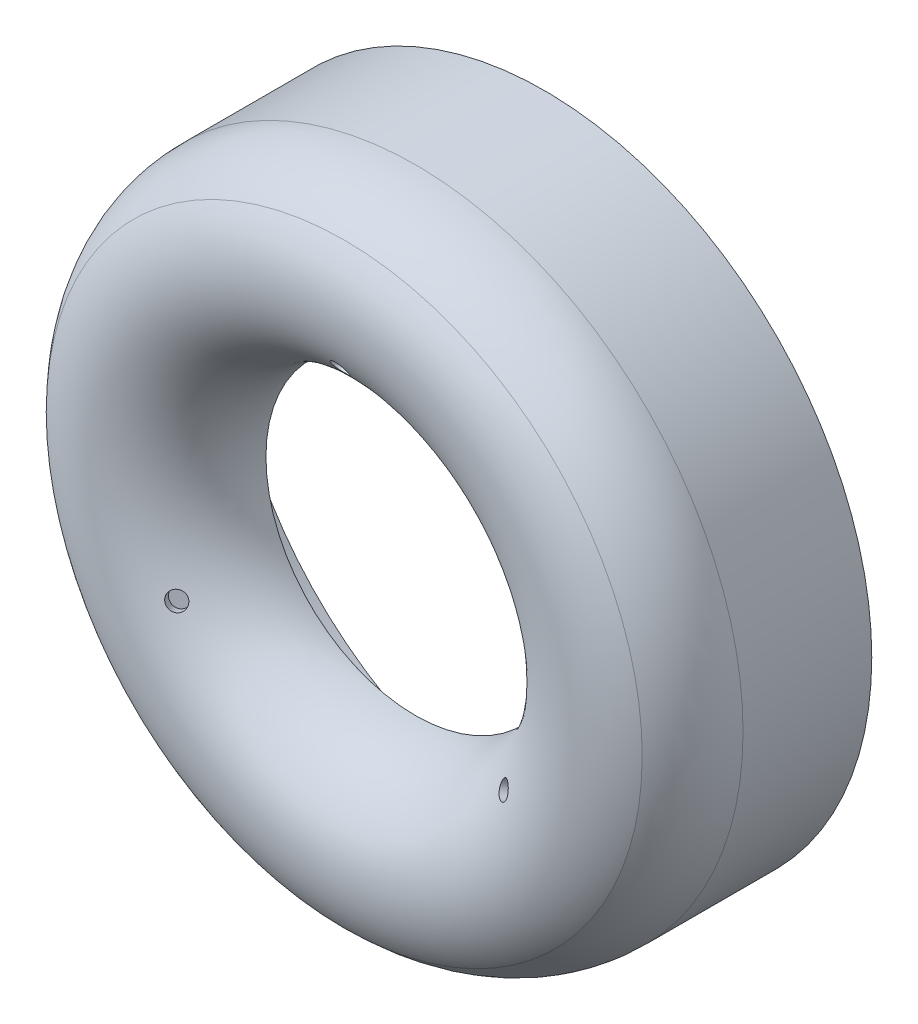
ISO-10303-21;
HEADER;
FILE_DESCRIPTION(('STEP AP214'),'2;1');
FILE_NAME('part.step','',(''),(''),'','','');
FILE_SCHEMA(('AUTOMOTIVE_DESIGN { 1 0 10303 214 1 1 1 1 }'));
ENDSEC;
DATA;
#1=APPLICATION_CONTEXT('core data for automotive mechanical design processes');
#2=APPLICATION_PROTOCOL_DEFINITION('international standard','automotive_design',2000,#1);
#3=PRODUCT_CONTEXT('',#1,'mechanical');
#4=PRODUCT('Part','Part','',(#3));
#5=PRODUCT_RELATED_PRODUCT_CATEGORY('part','',(#4));
#6=PRODUCT_DEFINITION_FORMATION('','',#4);
#7=PRODUCT_DEFINITION_CONTEXT('part definition',#1,'design');
#8=PRODUCT_DEFINITION('design','',#6,#7);
#9=PRODUCT_DEFINITION_SHAPE('','',#8);
#10=(LENGTH_UNIT() NAMED_UNIT(*) SI_UNIT(.MILLI.,.METRE.));
#11=(NAMED_UNIT(*) PLANE_ANGLE_UNIT() SI_UNIT($,.RADIAN.));
#12=(NAMED_UNIT(*) SI_UNIT($,.STERADIAN.) SOLID_ANGLE_UNIT());
#13=UNCERTAINTY_MEASURE_WITH_UNIT(LENGTH_MEASURE(1.E-05),#10,'distance_accuracy_value','');
#14=(GEOMETRIC_REPRESENTATION_CONTEXT(3) GLOBAL_UNCERTAINTY_ASSIGNED_CONTEXT((#13)) GLOBAL_UNIT_ASSIGNED_CONTEXT((#10,
#11,#12)) REPRESENTATION_CONTEXT('',''));
#15=CARTESIAN_POINT('',(0.,0.,0.));
#16=DIRECTION('',(0.,0.,1.));
#17=DIRECTION('',(1.,0.,0.));
#18=AXIS2_PLACEMENT_3D('',#15,#16,#17);
#19=CARTESIAN_POINT('',(0.,0.,22.05));
#20=DIRECTION('',(0.,0.,1.));
#21=DIRECTION('',(1.,0.,0.));
#22=AXIS2_PLACEMENT_3D('',#19,#20,#21);
#23=TOROIDAL_SURFACE('',#22,40.714829630286,13.914829630286);
#24=CARTESIAN_POINT('',(0.,0.,32.6899915095282));
#25=DIRECTION('',(0.,0.,1.));
#26=DIRECTION('',(1.,0.,0.));
#27=AXIS2_PLACEMENT_3D('',#24,#25,#26);
#28=CIRCLE('',#27,49.6821628078284);
#29=CARTESIAN_POINT('',(49.6821628078284,0.,32.6899915095282));
#30=VERTEX_POINT('',#29);
#31=EDGE_CURVE('E10',#30,#30,#28,.T.);
#32=ORIENTED_EDGE('',*,*,#31,.F.);
#33=EDGE_LOOP('',(#32));
#34=FACE_BOUND('',#33,.T.);
#35=CARTESIAN_POINT('',(0.,0.,22.05));
#36=DIRECTION('',(0.,0.,1.));
#37=DIRECTION('',(1.,0.,0.));
#38=AXIS2_PLACEMENT_3D('',#35,#36,#37);
#39=CIRCLE('',#38,26.8);
#40=CARTESIAN_POINT('',(26.8,0.,22.05));
#41=VERTEX_POINT('',#40);
#42=EDGE_CURVE('E55',#41,#41,#39,.T.);
#43=ORIENTED_EDGE('',*,*,#42,.T.);
#44=EDGE_LOOP('',(#43));
#45=FACE_BOUND('',#44,.T.);
#46=CARTESIAN_POINT('',(-0.521733762011657,31.8325098529892,32.7646073244406));
#47=CARTESIAN_POINT('',(-0.600944180860553,31.8550456416767,32.7843540172794));
#48=CARTESIAN_POINT('',(-0.677641653263316,31.8827829213394,32.8084899768785));
#49=CARTESIAN_POINT('',(-0.823807933247065,31.948029349292,32.8644484058016));
#50=CARTESIAN_POINT('',(-0.893267630618797,31.9855506096301,32.8962803988242));
#51=CARTESIAN_POINT('',(-1.02293757314441,32.0694724945865,32.96623048243));
#52=CARTESIAN_POINT('',(-1.0831573358239,32.1158638704251,33.0043420197232));
#53=CARTESIAN_POINT('',(-1.19279690070853,32.2165078415608,33.0853668560714));
#54=CARTESIAN_POINT('',(-1.24221910139305,32.2707586865597,33.1282790855322));
#55=CARTESIAN_POINT('',(-1.32930910287886,32.386393526415,33.2177328219196));
#56=CARTESIAN_POINT('',(-1.36687145306284,32.4478352017401,33.2643025289609));
#57=CARTESIAN_POINT('',(-1.42855542283515,32.5759556899049,33.3591190607013));
#58=CARTESIAN_POINT('',(-1.45267694174304,32.6426345419702,33.4073658979602));
#59=CARTESIAN_POINT('',(-1.48663799850221,32.7791312708159,33.5037247567194));
#60=CARTESIAN_POINT('',(-1.49654576570788,32.8489324816822,33.5518363083023));
#61=CARTESIAN_POINT('',(-1.50193835595653,32.9899988637126,33.6467011717599));
#62=CARTESIAN_POINT('',(-1.49742417788842,33.0612639331477,33.6934545774759));
#63=CARTESIAN_POINT('',(-1.47418494527232,33.2023153825031,33.7837902595701));
#64=CARTESIAN_POINT('',(-1.45562282578949,33.2721093543175,33.8274026613757));
#65=CARTESIAN_POINT('',(-1.40498283882947,33.4089201739399,33.9109815256538));
#66=CARTESIAN_POINT('',(-1.37290525135532,33.4759370792493,33.9509480636376));
#67=CARTESIAN_POINT('',(-1.29627959110834,33.6048690455523,34.0262564831292));
#68=CARTESIAN_POINT('',(-1.25177603840935,33.6668013172499,34.0616142256976));
#69=CARTESIAN_POINT('',(-1.15150804595216,33.7838756791506,34.1272378110669));
#70=CARTESIAN_POINT('',(-1.09574331829425,33.8390175956956,34.1575035236501));
#71=CARTESIAN_POINT('',(-0.974261085444931,33.9409631295014,34.2125998310252));
#72=CARTESIAN_POINT('',(-0.908502434210482,33.987730448627,34.2374068675623));
#73=CARTESIAN_POINT('',(-0.769057259859289,34.0711099677341,34.2811005577733));
#74=CARTESIAN_POINT('',(-0.695370617941962,34.1077220155099,34.2999871227128));
#75=CARTESIAN_POINT('',(-0.541906865659562,34.1696686624802,34.3316761813297));
#76=CARTESIAN_POINT('',(-0.462111975159515,34.1949687497289,34.3444600641022));
#77=CARTESIAN_POINT('',(-0.298892487636837,34.233268906957,34.3637293105502));
#78=CARTESIAN_POINT('',(-0.215467927468518,34.2462691017946,34.3702147381624));
#79=CARTESIAN_POINT('',(-0.047468869767225,34.2595152616345,34.376822297076));
#80=CARTESIAN_POINT('',(0.0371040582698576,34.259777165248,34.3769523804153));
#81=CARTESIAN_POINT('',(0.205095770772846,34.2475779715461,34.3708681208134));
#82=CARTESIAN_POINT('',(0.288514558459395,34.2351169097415,34.3646537955801));
#83=CARTESIAN_POINT('',(0.451757627075509,34.1979152880807,34.3459470869414));
#84=CARTESIAN_POINT('',(0.531584964410561,34.1731853934479,34.3334601561567));
#85=CARTESIAN_POINT('',(0.685469660887598,34.1122873181978,34.3023355895262));
#86=CARTESIAN_POINT('',(0.759526924342255,34.0761189479423,34.2836978517061));
#87=CARTESIAN_POINT('',(0.899904983934606,33.9934774596357,34.2404426458986));
#88=CARTESIAN_POINT('',(0.966212416763898,33.946986931496,34.2158150682413));
#89=CARTESIAN_POINT('',(1.08906912759826,33.8452647694829,34.1609153656609));
#90=CARTESIAN_POINT('',(1.14561840548235,33.7900331355011,34.1306432406678));
#91=CARTESIAN_POINT('',(1.24733824795143,33.6726324906937,34.0649242205711));
#92=CARTESIAN_POINT('',(1.29251140905153,33.610465067594,34.0294785092232));
#93=CARTESIAN_POINT('',(1.3702009930816,33.481173100958,33.9540492384137));
#94=CARTESIAN_POINT('',(1.40271789267493,33.4140487442243,33.9140658499244));
#95=CARTESIAN_POINT('',(1.45405367960733,33.2772653383214,33.830597582033));
#96=CARTESIAN_POINT('',(1.47293381334469,33.2076191163354,33.7871293450118));
#97=CARTESIAN_POINT('',(1.49672515719545,33.0676256973451,33.6975822601417));
#98=CARTESIAN_POINT('',(1.50163669121296,32.9972785166325,33.6515034728515));
#99=CARTESIAN_POINT('',(1.49741006839095,32.8580727664132,33.558065695187));
#100=CARTESIAN_POINT('',(1.48829937045267,32.7892115546296,33.5107093848198));
#101=CARTESIAN_POINT('',(1.45640411226914,32.6547233011676,33.416011629454));
#102=CARTESIAN_POINT('',(1.43361888391676,32.5890964176807,33.3686701852948));
#103=CARTESIAN_POINT('',(1.37483945028157,32.4622688676565,33.275124596236));
#104=CARTESIAN_POINT('',(1.33874442041995,32.4011063713146,33.2289320831787));
#105=CARTESIAN_POINT('',(1.25440228426602,32.2852482251926,33.1396291633256));
#106=CARTESIAN_POINT('',(1.20615415338853,32.230553121227,33.0965190167869));
#107=CARTESIAN_POINT('',(1.09822817163446,32.1283183658427,33.0144891263922));
#108=CARTESIAN_POINT('',(1.03843057459374,32.0808639274587,32.9756206225637));
#109=CARTESIAN_POINT('',(0.90938652706051,31.9949136412282,32.9041670780569));
#110=CARTESIAN_POINT('',(0.840140351186139,31.9564175331003,32.8715818548246));
#111=CARTESIAN_POINT('',(0.694238168389602,31.8893174001074,32.8141429460326));
#112=CARTESIAN_POINT('',(0.617596637797148,31.8606945317368,32.7892745418052));
#113=CARTESIAN_POINT('',(0.458939735121118,31.8139045988393,32.7483285257738));
#114=CARTESIAN_POINT('',(0.376923881486116,31.7957384726908,32.7322517029246));
#115=CARTESIAN_POINT('',(0.21135514315845,31.7705215411624,32.7098696806777));
#116=CARTESIAN_POINT('',(0.127851619547708,31.7632881710575,32.7034040167038));
#117=CARTESIAN_POINT('',(-0.0395234340419496,31.7595393091723,32.7000583667873));
#118=CARTESIAN_POINT('',(-0.123394434647576,31.76301158303,32.7031674388747));
#119=CARTESIAN_POINT('',(-0.260087647539851,31.7774766097883,32.7160421684466));
#120=CARTESIAN_POINT('',(-0.313522157988213,31.7854188410154,32.7231033727462));
#121=CARTESIAN_POINT('',(-0.418894912846663,31.8056947490119,32.7410413690391));
#122=CARTESIAN_POINT('',(-0.470833178257869,31.8180283641117,32.7519181074498));
#123=CARTESIAN_POINT('',(-0.521733762011657,31.8325098529892,32.7646073244406));
#124=B_SPLINE_CURVE_WITH_KNOTS('',3,(#46,#47,#48,#49,#50,#51,#52,#53,#54,#55,#56,#57,#58,#59,
#60,#61,#62,#63,#64,#65,#66,#67,#68,#69,#70,#71,#72,#73,#74,#75,#76,#77,#78,#79,#80,#81,#82,#83,
#84,#85,#86,#87,#88,#89,#90,#91,#92,#93,#94,#95,#96,#97,#98,#99,#100,#101,#102,#103,#104,#105,
#106,#107,#108,#109,#110,#111,#112,#113,#114,#115,#116,#117,#118,#119,#120,#121,#122,#123),
.UNSPECIFIED.,.T.,.F.,(4,2,2,2,2,2,2,2,2,2,2,2,2,2,2,2,2,2,2,2,2,2,2,2,2,2,2,2,2,2,2,2,2,2,2,2,
2,2,4),(0.,0.253862466223943,0.508040705128627,0.761955346168333,1.0158135272751,
1.27186913514604,1.52792666101161,1.7827508898161,2.03755746943589,2.28945312308016,
2.541343558401,2.79234284568289,3.04334855074714,3.29541716391616,3.54748955484821,
3.80032583791044,4.05315955436621,4.30567690797157,4.55819355678178,4.81049107799202,
5.06279278225784,5.31552331377957,5.56825384843436,5.82092664681334,6.07358992804378,
6.32511125199196,6.57662674361184,6.82765033372364,7.07868618928813,7.33166412718057,
7.58466339989531,7.84044218198319,8.09621353157364,8.35149399394215,8.60679736137429,
8.85778843015269,9.10849277382117,9.27162698483638,9.4347589050024),.UNSPECIFIED.);
#125=CARTESIAN_POINT('',(-0.521733762011657,31.8325098529892,32.7646073244406));
#126=VERTEX_POINT('',#125);
#127=EDGE_CURVE('E72',#126,#126,#124,.T.);
#128=ORIENTED_EDGE('',*,*,#127,.F.);
#129=EDGE_LOOP('',(#128));
#130=FACE_BOUND('',#129,.T.);
#131=CARTESIAN_POINT('',(27.2572563700765,-16.7006977895752,32.8709565622991));
#132=CARTESIAN_POINT('',(27.2607517234313,-16.6230209975031,32.8405588810337));
#133=CARTESIAN_POINT('',(27.2701693774533,-16.5442089031033,32.8136176949745));
#134=CARTESIAN_POINT('',(27.3004895993714,-16.3863841748502,32.7678388012722));
#135=CARTESIAN_POINT('',(27.3214013513845,-16.3073714309906,32.7490075952261));
#136=CARTESIAN_POINT('',(27.3740536058676,-16.1513050459985,32.7203354396635));
#137=CARTESIAN_POINT('',(27.4057976572242,-16.0742520558232,32.7104974403995));
#138=CARTESIAN_POINT('',(27.4791470294836,-15.9243450347842,32.7003050422349));
#139=CARTESIAN_POINT('',(27.5207501148873,-15.8514900566859,32.6999484955222));
#140=CARTESIAN_POINT('',(27.612126231127,-15.7128093909474,32.7086835883996));
#141=CARTESIAN_POINT('',(27.6618096294104,-15.6469183778188,32.717676832681));
#142=CARTESIAN_POINT('',(27.7682895961571,-15.5231841872399,32.7445317226589));
#143=CARTESIAN_POINT('',(27.8250865555842,-15.4653414524948,32.7623938559526));
#144=CARTESIAN_POINT('',(27.944576590536,-15.3591096260089,32.8062670601876));
#145=CARTESIAN_POINT('',(28.0072939128569,-15.3107621508103,32.8323127580164));
#146=CARTESIAN_POINT('',(28.1368746647434,-15.2251826949666,32.8914086121246));
#147=CARTESIAN_POINT('',(28.2037385171549,-15.1879518502074,32.924459483596));
#148=CARTESIAN_POINT('',(28.3412848384627,-15.1250920259081,32.9969062740922));
#149=CARTESIAN_POINT('',(28.4120148251461,-15.0996881045268,33.0364073483018));
#150=CARTESIAN_POINT('',(28.5544353224741,-15.0622971765826,33.1197912185799));
#151=CARTESIAN_POINT('',(28.62612589552,-15.0503110459831,33.1636743005185));
#152=CARTESIAN_POINT('',(28.7694446394155,-15.0401625129257,33.2547186244924));
#153=CARTESIAN_POINT('',(28.8410645876462,-15.0421435306605,33.301908936218));
#154=CARTESIAN_POINT('',(28.9816097480388,-15.0603569816579,33.3975385762202));
#155=CARTESIAN_POINT('',(29.0505350693808,-15.0765888368823,33.4459778537593));
#156=CARTESIAN_POINT('',(29.1833296319553,-15.1228015293922,33.542226003454));
#157=CARTESIAN_POINT('',(29.2472295407036,-15.1526899054955,33.5900369253654));
#158=CARTESIAN_POINT('',(29.3686135931263,-15.2253916164503,33.6839438963462));
#159=CARTESIAN_POINT('',(29.4260981558567,-15.2682041064095,33.730040057294));
#160=CARTESIAN_POINT('',(29.5323005157153,-15.3649741556122,33.8187893988588));
#161=CARTESIAN_POINT('',(29.5811076803323,-15.4188041180736,33.8614748385835));
#162=CARTESIAN_POINT('',(29.6691928725449,-15.5362994093244,33.9429627725555));
#163=CARTESIAN_POINT('',(29.7084709996117,-15.5999646354345,33.981765307333));
#164=CARTESIAN_POINT('',(29.7761400837693,-15.7350802261122,34.0546222653931));
#165=CARTESIAN_POINT('',(29.8045542277992,-15.8065135875967,34.0886867011178));
#166=CARTESIAN_POINT('',(29.8496336470919,-15.9551578156078,34.151582322066));
#167=CARTESIAN_POINT('',(29.8662986150245,-16.0323688332057,34.1804133703818));
#168=CARTESIAN_POINT('',(29.8872729006629,-16.1906588251555,34.2325427902727));
#169=CARTESIAN_POINT('',(29.8915251623864,-16.2717539248322,34.2558151629458));
#170=CARTESIAN_POINT('',(29.8872114905191,-16.4350942659937,34.2963657604047));
#171=CARTESIAN_POINT('',(29.8786454093449,-16.5173395207099,34.3136439161735));
#172=CARTESIAN_POINT('',(29.8487465074311,-16.6807737888002,34.3420528436148));
#173=CARTESIAN_POINT('',(29.8273830099466,-16.7619597836627,34.3531687199815));
#174=CARTESIAN_POINT('',(29.7723615821151,-16.9207037489907,34.3690792771478));
#175=CARTESIAN_POINT('',(29.738703794994,-16.9982617617096,34.3738740315841));
#176=CARTESIAN_POINT('',(29.6600641610371,-17.1473974589687,34.3770956139001));
#177=CARTESIAN_POINT('',(29.6150997648604,-17.2189841350018,34.3755321990906));
#178=CARTESIAN_POINT('',(29.515116027141,-17.3542840479245,34.3660737852457));
#179=CARTESIAN_POINT('',(29.4600966789561,-17.4179972796131,34.3581787820275));
#180=CARTESIAN_POINT('',(29.341671800774,-17.5357605663327,34.3361374067841));
#181=CARTESIAN_POINT('',(29.278270338245,-17.5898152784872,34.3219940590576));
#182=CARTESIAN_POINT('',(29.144980786888,-17.6868516954966,34.2876014803188));
#183=CARTESIAN_POINT('',(29.0750925928732,-17.7298332207495,34.2673521502817));
#184=CARTESIAN_POINT('',(28.9308377431654,-17.8036756999053,34.2209402047606));
#185=CARTESIAN_POINT('',(28.8564633231234,-17.8345149020296,34.1947671082843));
#186=CARTESIAN_POINT('',(28.7056443095951,-17.8831977584271,34.1368817275161));
#187=CARTESIAN_POINT('',(28.6291997238117,-17.901041461048,34.1051694638324));
#188=CARTESIAN_POINT('',(28.4766739886539,-17.9233238103056,34.0367419924127));
#189=CARTESIAN_POINT('',(28.4005925852206,-17.9277738595098,34.0000310680927));
#190=CARTESIAN_POINT('',(28.2510852272688,-17.9232760754043,33.9222798177203));
#191=CARTESIAN_POINT('',(28.1776591698983,-17.914328761598,33.8812396595981));
#192=CARTESIAN_POINT('',(28.0360504524396,-17.883464879509,33.7959354805361));
#193=CARTESIAN_POINT('',(27.9678446435841,-17.8616098280044,33.7516876189147));
#194=CARTESIAN_POINT('',(27.8383183802123,-17.8056908154226,33.6608979974068));
#195=CARTESIAN_POINT('',(27.7769976097724,-17.771627414833,33.6143563429134));
#196=CARTESIAN_POINT('',(27.6630271648053,-17.6923622801782,33.520305300813));
#197=CARTESIAN_POINT('',(27.610369179213,-17.6471713270607,33.4727968904788));
#198=CARTESIAN_POINT('',(27.5150198105954,-17.5469119387533,33.3781728223168));
#199=CARTESIAN_POINT('',(27.4723309539729,-17.4918410059919,33.3310572669582));
#200=CARTESIAN_POINT('',(27.3976017938036,-17.3727727555119,33.2383057897556));
#201=CARTESIAN_POINT('',(27.3656640548401,-17.3086972954,33.1926876707728));
#202=CARTESIAN_POINT('',(27.3136825957344,-17.173727953897,33.1049981386469));
#203=CARTESIAN_POINT('',(27.2936284977787,-17.1028400847547,33.062923658527));
#204=CARTESIAN_POINT('',(27.2696490262882,-16.9767866091505,32.9950179093192));
#205=CARTESIAN_POINT('',(27.2627703889567,-16.9228233311359,32.9679515905746));
#206=CARTESIAN_POINT('',(27.2553038764026,-16.8130058609683,32.9169671129284));
#207=CARTESIAN_POINT('',(27.2547160201078,-16.7571516631263,32.8930489634993));
#208=CARTESIAN_POINT('',(27.2572563700765,-16.7006977895752,32.8709565622991));
#209=B_SPLINE_CURVE_WITH_KNOTS('',3,(#131,#132,#133,#134,#135,#136,#137,#138,#139,#140,#141,
#142,#143,#144,#145,#146,#147,#148,#149,#150,#151,#152,#153,#154,#155,#156,#157,#158,#159,#160,
#161,#162,#163,#164,#165,#166,#167,#168,#169,#170,#171,#172,#173,#174,#175,#176,#177,#178,#179,
#180,#181,#182,#183,#184,#185,#186,#187,#188,#189,#190,#191,#192,#193,#194,#195,#196,#197,#198,
#199,#200,#201,#202,#203,#204,#205,#206,#207,#208),.UNSPECIFIED.,.T.,.F.,(4,2,2,2,2,2,2,2,2,2,2,
2,2,2,2,2,2,2,2,2,2,2,2,2,2,2,2,2,2,2,2,2,2,2,2,2,2,2,4),(0.,0.250243410467582,
0.500687063948589,0.751212846881025,1.0016818782922,1.24954144901038,1.49741464815922,
1.74635112045198,1.99531302012218,2.24883621827794,2.50237596640846,2.75852292470621,
3.01465949372754,3.26908702046108,3.52349791802324,3.77511406970792,4.02672759471981,
4.27780106413575,4.52888110078855,4.78111344323372,5.03334868976688,5.28619100373726,
5.5390303722414,5.79148187742137,6.04393354936772,6.29626316429923,6.54859687164121,
6.80138057546274,7.0541633388345,7.30673083689121,7.55928854150763,7.81065218938443,
8.06200429858629,8.31311383651166,8.56428694238129,8.81779246516045,9.07107627769194,
9.25294742567177,9.43481912086778),.UNSPECIFIED.);
#210=CARTESIAN_POINT('',(27.2572563700765,-16.7006977895752,32.8709565622991));
#211=VERTEX_POINT('',#210);
#212=EDGE_CURVE('E73',#211,#211,#209,.T.);
#213=ORIENTED_EDGE('',*,*,#212,.F.);
#214=EDGE_LOOP('',(#213));
#215=FACE_BOUND('',#214,.T.);
#216=CARTESIAN_POINT('',(-29.8504120536012,-16.6641223520567,34.3385248705906));
#217=CARTESIAN_POINT('',(-29.868739558452,-16.582814311236,34.3259723774176));
#218=CARTESIAN_POINT('',(-29.8807435013239,-16.500509837896,34.3102946793862));
#219=CARTESIAN_POINT('',(-29.8918711519991,-16.3363548797917,34.2728499220198));
#220=CARTESIAN_POINT('',(-29.8909814859554,-16.2545049545215,34.2510765629359));
#221=CARTESIAN_POINT('',(-29.876505210076,-16.0937595303902,34.2017144116568));
#222=CARTESIAN_POINT('',(-29.8629233080691,-16.0148629473546,34.1741277786707));
#223=CARTESIAN_POINT('',(-29.8236453989792,-15.8623659831327,34.1135302523721));
#224=CARTESIAN_POINT('',(-29.7979520984628,-15.7887644228871,34.0805205720357));
#225=CARTESIAN_POINT('',(-29.7354135221929,-15.6491353260737,34.0096680521228));
#226=CARTESIAN_POINT('',(-29.698582442265,-15.583098294887,33.9718314001196));
#227=CARTESIAN_POINT('',(-29.6149840439605,-15.4604798108746,33.8920347907847));
#228=CARTESIAN_POINT('',(-29.568216807665,-15.4038982799453,33.8500748675162));
#229=CARTESIAN_POINT('',(-29.4664846516541,-15.3021283728216,33.7631979771598));
#230=CARTESIAN_POINT('',(-29.4115603715432,-15.2568863456569,33.7182962535));
#231=CARTESIAN_POINT('',(-29.2950129266318,-15.1787381442654,33.6265010966536));
#232=CARTESIAN_POINT('',(-29.2333898162571,-15.1458318698247,33.5796076796507));
#233=CARTESIAN_POINT('',(-29.1052077348758,-15.0932262105626,33.4851369442667));
#234=CARTESIAN_POINT('',(-29.0386476247876,-15.0735298841783,33.4375594701117));
#235=CARTESIAN_POINT('',(-28.9024146621357,-15.0477988516044,33.3431744754627));
#236=CARTESIAN_POINT('',(-28.8327416173848,-15.0417649901029,33.2963670027522));
#237=CARTESIAN_POINT('',(-28.6913776802367,-15.0434025126177,33.2045898783524));
#238=CARTESIAN_POINT('',(-28.61967367708,-15.0512093676974,33.1596428484155));
#239=CARTESIAN_POINT('',(-28.4766936424144,-15.0804431733159,33.0736604685777));
#240=CARTESIAN_POINT('',(-28.4054176441625,-15.1018711687753,33.0326254190549));
#241=CARTESIAN_POINT('',(-28.2643759260512,-15.1579101837523,32.9556620203584));
#242=CARTESIAN_POINT('',(-28.1946299507311,-15.1926398433882,32.9197837457995));
#243=CARTESIAN_POINT('',(-28.059061128903,-15.2742137201264,32.8550689547715));
#244=CARTESIAN_POINT('',(-27.9932381442098,-15.3210575102042,32.826232190158));
#245=CARTESIAN_POINT('',(-27.8676237295448,-15.425126150105,32.7770500145475));
#246=CARTESIAN_POINT('',(-27.8077953916122,-15.4822805148276,32.7566498686672));
#247=CARTESIAN_POINT('',(-27.6952958291613,-15.6054802989021,32.725036534091));
#248=CARTESIAN_POINT('',(-27.6426236514914,-15.6715245318467,32.7138221209155));
#249=CARTESIAN_POINT('',(-27.5468317053155,-15.809228990542,32.7012520558589));
#250=CARTESIAN_POINT('',(-27.50355280496,-15.8807622506941,32.6997173091808));
#251=CARTESIAN_POINT('',(-27.4265734669656,-16.0284093458256,32.7061039751221));
#252=CARTESIAN_POINT('',(-27.3928725219855,-16.1045229379275,32.7140248867627));
#253=CARTESIAN_POINT('',(-27.3362787134235,-16.2585492199912,32.7388376080816));
#254=CARTESIAN_POINT('',(-27.3133016374383,-16.3364426739169,32.7556572281418));
#255=CARTESIAN_POINT('',(-27.2784631388306,-16.4925242676243,32.7974522742148));
#256=CARTESIAN_POINT('',(-27.2666025027936,-16.5707124278661,32.8224282771946));
#257=CARTESIAN_POINT('',(-27.254350415027,-16.7263688498934,32.8798281453319));
#258=CARTESIAN_POINT('',(-27.2541072181704,-16.8038152006799,32.9123429653488));
#259=CARTESIAN_POINT('',(-27.2656244993893,-16.9550083736168,32.9833101007172));
#260=CARTESIAN_POINT('',(-27.2773862234326,-17.0287548109267,33.0217630320223));
#261=CARTESIAN_POINT('',(-27.3130998534717,-17.1719526166327,33.1038569214768));
#262=CARTESIAN_POINT('',(-27.3372597244206,-17.2413072628488,33.1475763186045));
#263=CARTESIAN_POINT('',(-27.3974271960725,-17.3724907732099,33.2380535070063));
#264=CARTESIAN_POINT('',(-27.4334350116097,-17.4343195008625,33.2848113533632));
#265=CARTESIAN_POINT('',(-27.5165916188866,-17.5489225876307,33.3798780154868));
#266=CARTESIAN_POINT('',(-27.5637671703224,-17.601674665055,33.4281903119034));
#267=CARTESIAN_POINT('',(-27.6680051237536,-17.6964282456004,33.524691710653));
#268=CARTESIAN_POINT('',(-27.7250668559592,-17.7384304765477,33.5728808211074));
#269=CARTESIAN_POINT('',(-27.8468156683247,-17.810028256347,33.6671751186357));
#270=CARTESIAN_POINT('',(-27.9114138957605,-17.8397526947403,33.7132971728335));
#271=CARTESIAN_POINT('',(-28.0468279044234,-17.8865084840573,33.8027620089005));
#272=CARTESIAN_POINT('',(-28.1176434195604,-17.9035403779061,33.8461049095758));
#273=CARTESIAN_POINT('',(-28.2627616283519,-17.9242460690832,33.9286441301121));
#274=CARTESIAN_POINT('',(-28.3370324004283,-17.9280241996026,33.9678704678015));
#275=CARTESIAN_POINT('',(-28.4873123228525,-17.9223101384868,34.0417601201067));
#276=CARTESIAN_POINT('',(-28.5633214956638,-17.9128177752747,34.0764233757192));
#277=CARTESIAN_POINT('',(-28.71489416971,-17.8806967050588,34.1406391453123));
#278=CARTESIAN_POINT('',(-28.7904565618787,-17.8580432895034,34.1701819102714));
#279=CARTESIAN_POINT('',(-28.9386748306507,-17.8001113638213,34.2236376185988));
#280=CARTESIAN_POINT('',(-29.0113307262108,-17.7648329360525,34.2475505986906));
#281=CARTESIAN_POINT('',(-29.1518332521382,-17.682351573785,34.2895386926995));
#282=CARTESIAN_POINT('',(-29.2196571710249,-17.6350965474327,34.3075874971354));
#283=CARTESIAN_POINT('',(-29.3480793923666,-17.5299699768332,34.3375048670569));
#284=CARTESIAN_POINT('',(-29.4086762179308,-17.4720962687211,34.3493721709864));
#285=CARTESIAN_POINT('',(-29.5208325720794,-17.3472775907596,34.366809986624));
#286=CARTESIAN_POINT('',(-29.572385836869,-17.2803263900726,34.3723761484423));
#287=CARTESIAN_POINT('',(-29.6648410297174,-17.1392968658212,34.3771396349563));
#288=CARTESIAN_POINT('',(-29.7057537828723,-17.065225891475,34.3763434587367));
#289=CARTESIAN_POINT('',(-29.7646816940949,-16.9364374268717,34.3696739055545));
#290=CARTESIAN_POINT('',(-29.7858426917095,-16.883040995299,34.3654925921684));
#291=CARTESIAN_POINT('',(-29.8224546584073,-16.7746251540177,34.3542008892427));
#292=CARTESIAN_POINT('',(-29.8379056374778,-16.7196057471479,34.3470905048264));
#293=CARTESIAN_POINT('',(-29.8504120536012,-16.6641223520567,34.3385248705906));
#294=B_SPLINE_CURVE_WITH_KNOTS('',3,(#216,#217,#218,#219,#220,#221,#222,#223,#224,#225,#226,
#227,#228,#229,#230,#231,#232,#233,#234,#235,#236,#237,#238,#239,#240,#241,#242,#243,#244,#245,
#246,#247,#248,#249,#250,#251,#252,#253,#254,#255,#256,#257,#258,#259,#260,#261,#262,#263,#264,
#265,#266,#267,#268,#269,#270,#271,#272,#273,#274,#275,#276,#277,#278,#279,#280,#281,#282,#283,
#284,#285,#286,#287,#288,#289,#290,#291,#292,#293),.UNSPECIFIED.,.T.,.F.,(4,2,2,2,2,2,2,2,2,2,2,
2,2,2,2,2,2,2,2,2,2,2,2,2,2,2,2,2,2,2,2,2,2,2,2,2,2,2,4),(0.,0.252655028261212,
0.505572140734939,0.758395477921437,1.01116234276593,1.26360838801784,1.51605234793048,
1.76727835296222,2.0185023170222,2.26978442572267,2.52108206963185,2.77485297708395,
3.02864335445037,3.28475213313812,3.54085188519592,3.79526301828635,4.04964023225947,
4.2992967639584,4.54894006896527,4.79658854639678,5.04425454580433,5.29508027864564,
5.54593204685573,5.80113621757686,6.0563450160682,6.31217163882853,6.56798093607754,
6.82103201922873,7.0740722774701,7.32511608517456,7.57616313870544,7.82768303788606,
8.07920129633511,8.33183288447248,8.58451601092842,8.83737346684556,9.08997266364776,
9.26238099045582,9.43478901570546),.UNSPECIFIED.);
#295=CARTESIAN_POINT('',(-29.8504120536012,-16.6641223520567,34.3385248705906));
#296=VERTEX_POINT('',#295);
#297=EDGE_CURVE('E113',#296,#296,#294,.T.);
#298=ORIENTED_EDGE('',*,*,#297,.F.);
#299=EDGE_LOOP('',(#298));
#300=FACE_BOUND('',#299,.T.);
#301=ADVANCED_FACE('F41',(#34,#45,#130,#215,#300),#23,.F.);
#302=CARTESIAN_POINT('',(0.,0.,22.05));
#303=DIRECTION('',(0.,0.,1.));
#304=DIRECTION('',(1.,0.,0.));
#305=AXIS2_PLACEMENT_3D('',#302,#303,#304);
#306=TOROIDAL_SURFACE('',#305,41.0861991233501,15.5861991233501);
#307=CARTESIAN_POINT('',(0.,0.,22.05));
#308=DIRECTION('',(0.,0.,1.));
#309=DIRECTION('',(1.,0.,0.));
#310=AXIS2_PLACEMENT_3D('',#307,#308,#309);
#311=CIRCLE('',#310,25.5);
#312=CARTESIAN_POINT('',(25.5,0.,22.05));
#313=VERTEX_POINT('',#312);
#314=EDGE_CURVE('E61',#313,#313,#311,.T.);
#315=ORIENTED_EDGE('',*,*,#314,.F.);
#316=EDGE_LOOP('',(#315));
#317=FACE_BOUND('',#316,.T.);
#318=CARTESIAN_POINT('',(0.,0.,34.1909892337056));
#319=DIRECTION('',(0.,0.,1.));
#320=DIRECTION('',(1.,0.,0.));
#321=AXIS2_PLACEMENT_3D('',#318,#319,#320);
#322=CIRCLE('',#321,50.8599386093279);
#323=CARTESIAN_POINT('',(50.8599386093279,0.,34.1909892337056));
#324=VERTEX_POINT('',#323);
#325=EDGE_CURVE('E152',#324,#324,#322,.T.);
#326=ORIENTED_EDGE('',*,*,#325,.T.);
#327=EDGE_LOOP('',(#326));
#328=FACE_BOUND('',#327,.T.);
#329=CARTESIAN_POINT('',(-0.397394883361165,31.0744013421526,33.9975679765384));
#330=CARTESIAN_POINT('',(-0.31780451403299,31.0577164378121,33.9827395435677));
#331=CARTESIAN_POINT('',(-0.236291479338182,31.0460645913826,33.9723007349027));
#332=CARTESIAN_POINT('',(-0.0717447488099341,31.033134220725,33.9607112466997));
#333=CARTESIAN_POINT('',(0.0112901919668066,31.0318646070635,33.959568545564));
#334=CARTESIAN_POINT('',(0.176432768068643,31.0397433953911,33.966636685677));
#335=CARTESIAN_POINT('',(0.258540768156268,31.048887544081,33.9748437082132));
#336=CARTESIAN_POINT('',(0.419522107799566,31.0773646281661,34.000222253668));
#337=CARTESIAN_POINT('',(0.498395866425509,31.0966962390166,34.0173926111969));
#338=CARTESIAN_POINT('',(0.65099477975853,31.145168431377,34.0599951854223));
#339=CARTESIAN_POINT('',(0.724703082969866,31.1743394631507,34.085453040979));
#340=CARTESIAN_POINT('',(0.864743468138779,31.24181639555,34.1435421459692));
#341=CARTESIAN_POINT('',(0.931074649540833,31.2801234096514,34.1761742697508));
#342=CARTESIAN_POINT('',(1.0557793183625,31.3658147438857,34.2479888882716));
#343=CARTESIAN_POINT('',(1.11398396944955,31.413353086019,34.2872808401314));
#344=CARTESIAN_POINT('',(1.21941219944151,31.5159588535317,34.3704987863672));
#345=CARTESIAN_POINT('',(1.26663491261008,31.5710268719532,34.4144251456896));
#346=CARTESIAN_POINT('',(1.34932832377349,31.6881429508355,34.505937576671));
#347=CARTESIAN_POINT('',(1.38464499575191,31.7502695479175,34.5535624811636));
#348=CARTESIAN_POINT('',(1.4416668762814,31.8793708392872,34.6503676962704));
#349=CARTESIAN_POINT('',(1.46337242587364,31.9463454120569,34.6995479678809));
#350=CARTESIAN_POINT('',(1.49242301604964,32.0830592079559,34.7976923349522));
#351=CARTESIAN_POINT('',(1.49982768693084,32.1527857087156,34.8466564749708));
#352=CARTESIAN_POINT('',(1.5001663217989,32.2932773403348,34.9431225293606));
#353=CARTESIAN_POINT('',(1.49310120641171,32.3640424048324,34.9906245365633));
#354=CARTESIAN_POINT('',(1.46480290074089,32.503712478495,35.0823610817787));
#355=CARTESIAN_POINT('',(1.44372576821862,32.5726293718774,35.1266257138868));
#356=CARTESIAN_POINT('',(1.38812751529053,32.7072874598007,35.2113794974935));
#357=CARTESIAN_POINT('',(1.3536067220279,32.7730287315747,35.2518687408341));
#358=CARTESIAN_POINT('',(1.27227787131169,32.8989875059494,35.3280260300281));
#359=CARTESIAN_POINT('',(1.22552520046029,32.9592282971583,35.3637147371628));
#360=CARTESIAN_POINT('',(1.12098135817616,33.0726089817044,35.4298131276504));
#361=CARTESIAN_POINT('',(1.06319002623736,33.1257487717714,35.4602227342311));
#362=CARTESIAN_POINT('',(0.938032024792865,33.2233530229583,35.5153364659115));
#363=CARTESIAN_POINT('',(0.870640437970968,33.267794171034,35.5400252905205));
#364=CARTESIAN_POINT('',(0.728299473404351,33.3463782406783,35.583236574924));
#365=CARTESIAN_POINT('',(0.653349999492775,33.3805210311882,35.6017589562435));
#366=CARTESIAN_POINT('',(0.497802785499435,33.4374570596468,35.6324369298374));
#367=CARTESIAN_POINT('',(0.41719086332182,33.4602205508026,35.6445758392394));
#368=CARTESIAN_POINT('',(0.252779521514835,33.4935017588351,35.6622675642252));
#369=CARTESIAN_POINT('',(0.168980111409406,33.5040195122981,35.6678203994861));
#370=CARTESIAN_POINT('',(0.000595758117322856,33.5124536558327,35.6722759776324));
#371=CARTESIAN_POINT('',(-0.0839889775621631,33.5103732851326,35.6711804299492));
#372=CARTESIAN_POINT('',(-0.251562093556725,33.4936889942237,35.6623555992269));
#373=CARTESIAN_POINT('',(-0.33455047172092,33.4790850571422,35.6546263072502));
#374=CARTESIAN_POINT('',(-0.496553094618159,33.437850796542,35.6326265435206));
#375=CARTESIAN_POINT('',(-0.575568432722791,33.4112238020959,35.6183578824417));
#376=CARTESIAN_POINT('',(-0.72741336908988,33.3468316370131,35.5834549736141));
#377=CARTESIAN_POINT('',(-0.800242907809348,33.3090663591776,35.5628206646));
#378=CARTESIAN_POINT('',(-0.937701888760858,33.2236125466584,35.5154477671879));
#379=CARTESIAN_POINT('',(-1.00232561691696,33.1759171575362,35.4887049610448));
#380=CARTESIAN_POINT('',(-1.12147688424561,33.0721754465947,35.4295291426368));
#381=CARTESIAN_POINT('',(-1.17600453346391,33.0161292158102,35.3970961924012));
#382=CARTESIAN_POINT('',(-1.2733421142087,32.8975752517368,35.3271509185862));
#383=CARTESIAN_POINT('',(-1.31616797399064,32.8350764629337,35.2896456044917));
#384=CARTESIAN_POINT('',(-1.38898188954847,32.7055408143084,35.2102666248215));
#385=CARTESIAN_POINT('',(-1.41897034071638,32.6385040943279,35.1683930938362));
#386=CARTESIAN_POINT('',(-1.46519326991703,32.5022189932125,35.0813725394441));
#387=CARTESIAN_POINT('',(-1.48147516609793,32.4329791041889,35.0362373931835));
#388=CARTESIAN_POINT('',(-1.50004328783278,32.2941464453257,34.9436926812998));
#389=CARTESIAN_POINT('',(-1.50232954596429,32.2245536763077,34.896283120971));
#390=CARTESIAN_POINT('',(-1.49290323461202,32.0869479098178,34.800438521745));
#391=CARTESIAN_POINT('',(-1.48117727480587,32.0189364868658,34.7520025454622));
#392=CARTESIAN_POINT('',(-1.44410493822142,31.8864059852179,34.6555731343654));
#393=CARTESIAN_POINT('',(-1.41875819204357,31.8218870012904,34.6075797115895));
#394=CARTESIAN_POINT('',(-1.35490432961758,31.6974047148552,34.5131013372818));
#395=CARTESIAN_POINT('',(-1.31627791594454,31.6374889517667,34.4666343951053));
#396=CARTESIAN_POINT('',(-1.22699723281248,31.5243173458418,34.3772381181733));
#397=CARTESIAN_POINT('',(-1.17633953271591,31.4710634092032,34.3343097971429));
#398=CARTESIAN_POINT('',(-1.06385017346155,31.3720005656673,34.2531716209039));
#399=CARTESIAN_POINT('',(-1.0019173487718,31.3262668490025,34.2150102404885));
#400=CARTESIAN_POINT('',(-0.868932263448223,31.2439580565428,34.1454246292769));
#401=CARTESIAN_POINT('',(-0.797889821148568,31.2073732435176,34.1139932408808));
#402=CARTESIAN_POINT('',(-0.671892924277069,31.1540114387603,34.0677020233282));
#403=CARTESIAN_POINT('',(-0.61879630286845,31.1346116786492,34.0507274471506));
#404=CARTESIAN_POINT('',(-0.509923917209135,31.1007554113443,34.0209473023795));
#405=CARTESIAN_POINT('',(-0.454148204829439,31.086298808488,34.0081416531071));
#406=CARTESIAN_POINT('',(-0.397394883361165,31.0744013421526,33.9975679765384));
#407=B_SPLINE_CURVE_WITH_KNOTS('',3,(#329,#330,#331,#332,#333,#334,#335,#336,#337,#338,#339,
#340,#341,#342,#343,#344,#345,#346,#347,#348,#349,#350,#351,#352,#353,#354,#355,#356,#357,#358,
#359,#360,#361,#362,#363,#364,#365,#366,#367,#368,#369,#370,#371,#372,#373,#374,#375,#376,#377,
#378,#379,#380,#381,#382,#383,#384,#385,#386,#387,#388,#389,#390,#391,#392,#393,#394,#395,#396,
#397,#398,#399,#400,#401,#402,#403,#404,#405,#406),.UNSPECIFIED.,.T.,.F.,(4,2,2,2,2,2,2,2,2,2,2,
2,2,2,2,2,2,2,2,2,2,2,2,2,2,2,2,2,2,2,2,2,2,2,2,2,2,2,4),(0.,0.247771571077913,
0.495755770180862,0.743638721266265,0.991489451268917,1.24011435704701,1.48876958025062,
1.74199904753532,1.99524847083265,2.25165856269209,2.50806222966691,2.76339444363991,
3.01871041285598,3.27122942054844,3.52374228373055,3.77513096988328,4.02652331159512,
4.27858044659822,4.53064078919109,4.78335664504766,5.03607174587015,5.2887218713718,
5.54137233726216,5.79395288944966,6.04653587264016,6.29929378729399,6.55204894676182,
6.80445832707738,7.0568599326277,7.30838471798649,7.55990891787231,7.81167367105565,
8.06344525251449,8.31754041930829,8.57170812674116,8.82828009443184,9.08457781767304,
9.26125914100314,9.43793704491011),.UNSPECIFIED.);
#408=CARTESIAN_POINT('',(-0.397394883361165,31.0744013421526,33.9975679765384));
#409=VERTEX_POINT('',#408);
#410=EDGE_CURVE('E65',#409,#409,#407,.T.);
#411=ORIENTED_EDGE('',*,*,#410,.F.);
#412=EDGE_LOOP('',(#411));
#413=FACE_BOUND('',#412,.T.);
#414=CARTESIAN_POINT('',(26.7626981006686,-16.9975832813161,34.4962342438697));
#415=CARTESIAN_POINT('',(26.7956562203121,-17.0603880017322,34.5425860429189));
#416=CARTESIAN_POINT('',(26.8343464158523,-17.1192402246299,34.5903118096767));
#417=CARTESIAN_POINT('',(26.922294676107,-17.2274034622372,34.6869304618675));
#418=CARTESIAN_POINT('',(26.9715628020462,-17.2767053075584,34.735824418802));
#419=CARTESIAN_POINT('',(27.0793838186608,-17.3643188912937,34.8332475811115));
#420=CARTESIAN_POINT('',(27.1379371979564,-17.4026300510441,34.8817767671502));
#421=CARTESIAN_POINT('',(27.2626703800529,-17.4670825960129,34.9770516704802));
#422=CARTESIAN_POINT('',(27.3288483646403,-17.4932268751629,35.0237978094441));
#423=CARTESIAN_POINT('',(27.4663565830391,-17.5323639987781,35.1139344720506));
#424=CARTESIAN_POINT('',(27.5376440352284,-17.545454873992,35.1573477132268));
#425=CARTESIAN_POINT('',(27.6836585615927,-17.5583548698714,35.2401832227304));
#426=CARTESIAN_POINT('',(27.7583856996142,-17.5581637439003,35.2796054169336));
#427=CARTESIAN_POINT('',(27.9087281264924,-17.5444235773778,35.353506424091));
#428=CARTESIAN_POINT('',(27.9843395646711,-17.5309196409591,35.3880014785636));
#429=CARTESIAN_POINT('',(28.1343847667001,-17.4908994031777,35.4515791198494));
#430=CARTESIAN_POINT('',(28.2088185144948,-17.4643829245705,35.4806616329306));
#431=CARTESIAN_POINT('',(28.3544556855646,-17.3988833195721,35.5330306783472));
#432=CARTESIAN_POINT('',(28.4256486790858,-17.3598628014363,35.5562994491904));
#433=CARTESIAN_POINT('',(28.5623911388254,-17.2703869150786,35.5965985812401));
#434=CARTESIAN_POINT('',(28.6279405516612,-17.2199314387099,35.613628883442));
#435=CARTESIAN_POINT('',(28.751553600381,-17.108806377059,35.6412660476991));
#436=CARTESIAN_POINT('',(28.8096000194677,-17.0481140116143,35.6518583357494));
#437=CARTESIAN_POINT('',(28.9162958369711,-16.9182659572776,35.6664335163791));
#438=CARTESIAN_POINT('',(28.9649452627959,-16.8491102930713,35.6704164282362));
#439=CARTESIAN_POINT('',(29.0514103799448,-16.704313295174,35.6717273671484));
#440=CARTESIAN_POINT('',(29.0892308962111,-16.628674869531,35.6690583631996));
#441=CARTESIAN_POINT('',(29.1530165833295,-16.4730475090104,35.6571019266576));
#442=CARTESIAN_POINT('',(29.1789817226604,-16.3930585625663,35.6478144764673));
#443=CARTESIAN_POINT('',(29.2183971397089,-16.2310536078294,35.6227312069839));
#444=CARTESIAN_POINT('',(29.2318487941509,-16.1490378235473,35.606936103934));
#445=CARTESIAN_POINT('',(29.2459871943165,-15.985364200057,35.5690350788695));
#446=CARTESIAN_POINT('',(29.2466738286527,-15.9037063639785,35.5469291017882));
#447=CARTESIAN_POINT('',(29.2354174895626,-15.7431022613732,35.4966958856495));
#448=CARTESIAN_POINT('',(29.2234665405311,-15.6641577397078,35.468564853107));
#449=CARTESIAN_POINT('',(29.1874393302247,-15.5113829383868,35.4067304042554));
#450=CARTESIAN_POINT('',(29.1633632345089,-15.437552588917,35.3730270640358));
#451=CARTESIAN_POINT('',(29.104007187287,-15.2973410962645,35.3007159554568));
#452=CARTESIAN_POINT('',(29.0687469856141,-15.2309470989005,35.2621169039207));
#453=CARTESIAN_POINT('',(28.9881911209055,-15.1074475308637,35.1807586486219));
#454=CARTESIAN_POINT('',(28.9428957829516,-15.0503416594119,35.1379995796454));
#455=CARTESIAN_POINT('',(28.8438841945137,-14.9472811818696,35.0494602418373));
#456=CARTESIAN_POINT('',(28.7901968115685,-14.9012896758394,35.0036906304457));
#457=CARTESIAN_POINT('',(28.6759224507103,-14.8215177991058,34.910170570846));
#458=CARTESIAN_POINT('',(28.6153354487423,-14.7877374709773,34.8624201157322));
#459=CARTESIAN_POINT('',(28.4888916623898,-14.7332335024259,34.7661736895355));
#460=CARTESIAN_POINT('',(28.4230249866641,-14.7125350467504,34.7176764634566));
#461=CARTESIAN_POINT('',(28.2879260055681,-14.6847731427368,34.621474353539));
#462=CARTESIAN_POINT('',(28.2186934806662,-14.6777105850027,34.5737695216557));
#463=CARTESIAN_POINT('',(28.077953442444,-14.67729299876,34.4802022409003));
#464=CARTESIAN_POINT('',(28.0064301048348,-14.6840757153648,34.4343629789847));
#465=CARTESIAN_POINT('',(27.8635737742875,-14.7113202635414,34.346614439862));
#466=CARTESIAN_POINT('',(27.792240794819,-14.7317830386236,34.3047054339511));
#467=CARTESIAN_POINT('',(27.6509548368541,-14.7859498270229,34.2260475399152));
#468=CARTESIAN_POINT('',(27.5810173656121,-14.8197579577754,34.1893423879456));
#469=CARTESIAN_POINT('',(27.4448726080366,-14.8995966179637,34.1229722876283));
#470=CARTESIAN_POINT('',(27.3786651806861,-14.9456266849637,34.0933070729942));
#471=CARTESIAN_POINT('',(27.252186166484,-15.0481605404002,34.042501131932));
#472=CARTESIAN_POINT('',(27.1918732839789,-15.1045820530681,34.0212973207254));
#473=CARTESIAN_POINT('',(27.0782572258083,-15.2264615338216,33.9880729371809));
#474=CARTESIAN_POINT('',(27.0249531160344,-15.2919182953277,33.9760511400626));
#475=CARTESIAN_POINT('',(26.927809228738,-15.4285910157678,33.9619055263781));
#476=CARTESIAN_POINT('',(26.8838088082817,-15.4996738497607,33.959597907574));
#477=CARTESIAN_POINT('',(26.8052819668098,-15.6465800722005,33.9644857544437));
#478=CARTESIAN_POINT('',(26.7707546631196,-15.7224030181699,33.9716803343695));
#479=CARTESIAN_POINT('',(26.7124514259952,-15.8759420811342,33.9951243967997));
#480=CARTESIAN_POINT('',(26.6885830482192,-15.9536355052483,34.0112931808427));
#481=CARTESIAN_POINT('',(26.6518649391456,-16.1094781210965,34.051908540273));
#482=CARTESIAN_POINT('',(26.6390182086226,-16.1876274311239,34.0763573674752));
#483=CARTESIAN_POINT('',(26.624698553621,-16.3433064738423,34.1328475390357));
#484=CARTESIAN_POINT('',(26.62336944741,-16.4208163304818,34.1649797538363));
#485=CARTESIAN_POINT('',(26.6326299958433,-16.5722003618021,34.2353605322359));
#486=CARTESIAN_POINT('',(26.6432090260419,-16.6460777160691,34.2736036176101));
#487=CARTESIAN_POINT('',(26.6711735689297,-16.76698777325,34.342563498637));
#488=CARTESIAN_POINT('',(26.6855611742509,-16.8154197879765,34.3720917882899));
#489=CARTESIAN_POINT('',(26.7199559724456,-16.9090559171718,34.4329401829294));
#490=CARTESIAN_POINT('',(26.73996326823,-16.9542599725093,34.4642603207211));
#491=CARTESIAN_POINT('',(26.7626981006686,-16.9975832813161,34.4962342438697));
#492=B_SPLINE_CURVE_WITH_KNOTS('',3,(#414,#415,#416,#417,#418,#419,#420,#421,#422,#423,#424,
#425,#426,#427,#428,#429,#430,#431,#432,#433,#434,#435,#436,#437,#438,#439,#440,#441,#442,#443,
#444,#445,#446,#447,#448,#449,#450,#451,#452,#453,#454,#455,#456,#457,#458,#459,#460,#461,#462,
#463,#464,#465,#466,#467,#468,#469,#470,#471,#472,#473,#474,#475,#476,#477,#478,#479,#480,#481,
#482,#483,#484,#485,#486,#487,#488,#489,#490,#491),.UNSPECIFIED.,.T.,.F.,(4,2,2,2,2,2,2,2,2,2,2,
2,2,2,2,2,2,2,2,2,2,2,2,2,2,2,2,2,2,2,2,2,2,2,2,2,2,2,4),(0.,0.253980551810205,
0.508203756601332,0.762440343884743,1.01661642923303,1.26886894793451,1.52112615077246,
1.77253162689225,2.02394052751326,2.27610836246827,2.52827858241467,2.781017545044,
3.03375577050448,3.28638120974796,3.53900732067254,3.79160563456871,4.04420615263172,
4.29696618260364,4.54972276143676,4.8020354633822,5.05433999301412,5.30579498937395,
5.55725086243642,5.80918936638248,6.06114432468091,6.31561816969861,6.57010956752848,
6.82662698748722,7.08313470309829,7.33769257465008,7.59221648502539,7.84190227152611,
8.09156478519714,8.33901781074198,8.58653818695494,8.83714491426111,9.0875282272131,
9.26272328096523,9.43792154319932),.UNSPECIFIED.);
#493=CARTESIAN_POINT('',(26.7626981006686,-16.9975832813161,34.4962342438697));
#494=VERTEX_POINT('',#493);
#495=EDGE_CURVE('E74',#494,#494,#492,.T.);
#496=ORIENTED_EDGE('',*,*,#495,.F.);
#497=EDGE_LOOP('',(#496));
#498=FACE_BOUND('',#497,.T.);
#499=CARTESIAN_POINT('',(-26.7626981006688,-16.9975832813157,34.4962342438697));
#500=CARTESIAN_POINT('',(-26.7295051252848,-16.9343166727051,34.449544385836));
#501=CARTESIAN_POINT('',(-26.7020869525937,-16.8669606127867,34.4041907119553));
#502=CARTESIAN_POINT('',(-26.6594111460537,-16.7258560673626,34.3177834785676));
#503=CARTESIAN_POINT('',(-26.6441671860568,-16.6521004967944,34.2767347991592));
#504=CARTESIAN_POINT('',(-26.626114399455,-16.5001534940244,34.2005334021092));
#505=CARTESIAN_POINT('',(-26.6233040864277,-16.4219625931912,34.1653799801825));
#506=CARTESIAN_POINT('',(-26.6300489890587,-16.2632136235545,34.1024140469104));
#507=CARTESIAN_POINT('',(-26.6396006342493,-16.1826562448204,34.074599418716));
#508=CARTESIAN_POINT('',(-26.6705588164454,-16.0219657511149,34.0277061060041));
#509=CARTESIAN_POINT('',(-26.6918735823184,-15.9418341402678,34.0085618577387));
#510=CARTESIAN_POINT('',(-26.7456049399504,-15.7836335732264,33.9795894036805));
#511=CARTESIAN_POINT('',(-26.7780205043744,-15.7055644268791,33.9697603361215));
#512=CARTESIAN_POINT('',(-26.8522355524783,-15.5552240936305,33.9599880495834));
#513=CARTESIAN_POINT('',(-26.8938446235787,-15.4828708176175,33.9598601749872));
#514=CARTESIAN_POINT('',(-26.9855782213174,-15.3444365340197,33.9690310881432));
#515=CARTESIAN_POINT('',(-27.0357023445174,-15.2783552295035,33.9783294293903));
#516=CARTESIAN_POINT('',(-27.1427259155728,-15.1547693887062,34.0058260713176));
#517=CARTESIAN_POINT('',(-27.1995797114951,-15.0972124211236,34.0239667435358));
#518=CARTESIAN_POINT('',(-27.3188392283802,-14.991776415,34.0683172035475));
#519=CARTESIAN_POINT('',(-27.38124535591,-14.9438980860142,34.0945275825881));
#520=CARTESIAN_POINT('',(-27.5109653664354,-14.8585518492611,34.15434247159));
#521=CARTESIAN_POINT('',(-27.5783353486687,-14.8212376710094,34.1880445675968));
#522=CARTESIAN_POINT('',(-27.7155681908604,-14.7589735587971,34.2612919921547));
#523=CARTESIAN_POINT('',(-27.7854313127844,-14.7340249282658,34.3008379361247));
#524=CARTESIAN_POINT('',(-27.9272258719769,-14.6969172295865,34.3850582820149));
#525=CARTESIAN_POINT('',(-27.9991720587523,-14.6849914046534,34.4298108094979));
#526=CARTESIAN_POINT('',(-28.1421182895049,-14.6751670475712,34.5222740545735));
#527=CARTESIAN_POINT('',(-28.2131183125354,-14.6772688254572,34.5699848375258));
#528=CARTESIAN_POINT('',(-28.3525336519275,-14.6955975311866,34.6669217982735));
#529=CARTESIAN_POINT('',(-28.4209404270586,-14.7118675090146,34.7161521531376));
#530=CARTESIAN_POINT('',(-28.5530345152424,-14.7582412256873,34.8144296634013));
#531=CARTESIAN_POINT('',(-28.6167221093615,-14.788344139896,34.8634768295458));
#532=CARTESIAN_POINT('',(-28.7369006471737,-14.8612142591476,34.9594573105271));
#533=CARTESIAN_POINT('',(-28.7934569308469,-14.9038523880162,35.0064068097863));
#534=CARTESIAN_POINT('',(-28.898382480627,-15.000684552777,35.0974488612031));
#535=CARTESIAN_POINT('',(-28.9467521279196,-15.0548780503632,35.1415415463203));
#536=CARTESIAN_POINT('',(-29.0334029636462,-15.1727183782003,35.2254530971113));
#537=CARTESIAN_POINT('',(-29.0717643621832,-15.2362832263367,35.265304324724));
#538=CARTESIAN_POINT('',(-29.1376648446141,-15.3713056112276,35.3403056143237));
#539=CARTESIAN_POINT('',(-29.1652039094057,-15.442763161913,35.3754556680126));
#540=CARTESIAN_POINT('',(-29.2085061278787,-15.5914632228546,35.4404101513733));
#541=CARTESIAN_POINT('',(-29.2242664783989,-15.6687071053637,35.4702133072802));
#542=CARTESIAN_POINT('',(-29.2433789792442,-15.8266831282751,35.5239820980381));
#543=CARTESIAN_POINT('',(-29.246730907622,-15.9074153310463,35.5479476284654));
#544=CARTESIAN_POINT('',(-29.2407570631709,-16.0702809360901,35.5897710519269));
#545=CARTESIAN_POINT('',(-29.2313878800595,-16.1524181870803,35.6076077699441));
#546=CARTESIAN_POINT('',(-29.2000222409502,-16.3154196139556,35.6368298597769));
#547=CARTESIAN_POINT('',(-29.1780257480642,-16.3962837861208,35.6482152127461));
#548=CARTESIAN_POINT('',(-29.1219088994372,-16.5544623940788,35.6644060611362));
#549=CARTESIAN_POINT('',(-29.0877781492983,-16.6317737221305,35.6692058981169));
#550=CARTESIAN_POINT('',(-29.0083241042276,-16.7805504587336,35.6721525442142));
#551=CARTESIAN_POINT('',(-28.9630008538236,-16.8520158905408,35.6702993797986));
#552=CARTESIAN_POINT('',(-28.8625008010244,-16.9870331846094,35.6599646196159));
#553=CARTESIAN_POINT('',(-28.8073306704409,-17.0505903559797,35.6514874988936));
#554=CARTESIAN_POINT('',(-28.6887526024268,-17.1680880008401,35.6280087639622));
#555=CARTESIAN_POINT('',(-28.6253445871363,-17.2220283834262,35.6130070880836));
#556=CARTESIAN_POINT('',(-28.492173924763,-17.3188582065904,35.5766561321861));
#557=CARTESIAN_POINT('',(-28.4224082020048,-17.36174225961,35.5553037684592));
#558=CARTESIAN_POINT('',(-28.2786802097399,-17.4353000022166,35.5065452317443));
#559=CARTESIAN_POINT('',(-28.2047179241327,-17.4659736449532,35.4791390355289));
#560=CARTESIAN_POINT('',(-28.0548775964789,-17.5143387885646,35.4186963715389));
#561=CARTESIAN_POINT('',(-27.9789996547613,-17.5320309678668,35.3856601981053));
#562=CARTESIAN_POINT('',(-27.8276736893178,-17.5540349712288,35.3145403459206));
#563=CARTESIAN_POINT('',(-27.7522256402805,-17.5583475913528,35.2764569676114));
#564=CARTESIAN_POINT('',(-27.6043158656759,-17.5535844594347,35.1961362386526));
#565=CARTESIAN_POINT('',(-27.5318455741383,-17.5445503472929,35.1539121895888));
#566=CARTESIAN_POINT('',(-27.3918249545528,-17.5135252787155,35.0661614297007));
#567=CARTESIAN_POINT('',(-27.3242755470473,-17.4915319049687,35.0206341041007));
#568=CARTESIAN_POINT('',(-27.1962095344751,-17.4353577605273,34.9275166801172));
#569=CARTESIAN_POINT('',(-27.1356819948057,-17.4011962853764,34.8799299517881));
#570=CARTESIAN_POINT('',(-27.0232692095993,-17.3217308374318,34.7839657420264));
#571=CARTESIAN_POINT('',(-26.9713754987357,-17.2764378881263,34.7355890868379));
#572=CARTESIAN_POINT('',(-26.8927630502783,-17.192324831472,34.6550668517662));
#573=CARTESIAN_POINT('',(-26.863335018091,-17.1561616615077,34.6227404380756));
#574=CARTESIAN_POINT('',(-26.8093220576552,-17.0797943872456,34.5588244075616));
#575=CARTESIAN_POINT('',(-26.7847371598138,-17.0395902575794,34.5272347953652));
#576=CARTESIAN_POINT('',(-26.7626981006688,-16.9975832813157,34.4962342438697));
#577=B_SPLINE_CURVE_WITH_KNOTS('',3,(#499,#500,#501,#502,#503,#504,#505,#506,#507,#508,#509,
#510,#511,#512,#513,#514,#515,#516,#517,#518,#519,#520,#521,#522,#523,#524,#525,#526,#527,#528,
#529,#530,#531,#532,#533,#534,#535,#536,#537,#538,#539,#540,#541,#542,#543,#544,#545,#546,#547,
#548,#549,#550,#551,#552,#553,#554,#555,#556,#557,#558,#559,#560,#561,#562,#563,#564,#565,#566,
#567,#568,#569,#570,#571,#572,#573,#574,#575,#576),.UNSPECIFIED.,.T.,.F.,(4,2,2,2,2,2,2,2,2,2,2,
2,2,2,2,2,2,2,2,2,2,2,2,2,2,2,2,2,2,2,2,2,2,2,2,2,2,2,4),(0.,0.255840530033695,
0.511968012896918,0.768064875305612,1.0240877865227,1.27814098203513,1.53217067227875,
1.78136384261487,2.03054520961376,2.27812386292694,2.52572066001955,2.77675428833041,
3.02781437200204,3.28330080609895,3.53879288692365,3.79506399824998,4.05131983422217,
4.30502425888945,4.55871686733728,4.81030907009217,5.06190171692593,5.31355422006808,
5.56521122445484,5.81772916010283,6.07024783343631,6.32298334155161,6.57571784420794,
6.82828175072416,7.08084804450718,7.33353717786363,7.58622728075852,7.83890417681293,
8.09156603867283,8.3434412943736,8.59536354763773,8.84688808124642,9.09816452698822,
9.26803327507292,9.43790308963098),.UNSPECIFIED.);
#578=CARTESIAN_POINT('',(-26.7626981006688,-16.9975832813157,34.4962342438697));
#579=VERTEX_POINT('',#578);
#580=EDGE_CURVE('E45',#579,#579,#577,.T.);
#581=ORIENTED_EDGE('',*,*,#580,.F.);
#582=EDGE_LOOP('',(#581));
#583=FACE_BOUND('',#582,.T.);
#584=ADVANCED_FACE('F79',(#317,#328,#413,#498,#583),#306,.T.);
#585=CARTESIAN_POINT('',(0.,0.,21.6069622781994));
#586=DIRECTION('',(0.,0.,1.));
#587=DIRECTION('',(1.,0.,0.));
#588=AXIS2_PLACEMENT_3D('',#585,#586,#587);
#589=TOROIDAL_SURFACE('',#588,39.5193932159058,15.0371347909433);
#590=CARTESIAN_POINT('',(0.,0.,22.05));
#591=DIRECTION('',(0.,0.,1.));
#592=DIRECTION('',(1.,0.,0.));
#593=AXIS2_PLACEMENT_3D('',#590,#591,#592);
#594=CIRCLE('',#593,54.55);
#595=CARTESIAN_POINT('',(54.55,0.,22.05));
#596=VERTEX_POINT('',#595);
#597=EDGE_CURVE('E101',#596,#596,#594,.T.);
#598=ORIENTED_EDGE('',*,*,#597,.F.);
#599=EDGE_LOOP('',(#598));
#600=FACE_BOUND('',#599,.T.);
#601=ORIENTED_EDGE('',*,*,#31,.T.);
#602=EDGE_LOOP('',(#601));
#603=FACE_BOUND('',#602,.T.);
#604=ADVANCED_FACE('F43',(#600,#603),#589,.F.);
#605=CARTESIAN_POINT('',(0.,25.5,22.05));
#606=DIRECTION('',(0.,0.,1.));
#607=DIRECTION('',(1.,0.,0.));
#608=AXIS2_PLACEMENT_3D('',#605,#606,#607);
#609=PLANE('',#608);
#610=ORIENTED_EDGE('',*,*,#42,.F.);
#611=EDGE_LOOP('',(#610));
#612=FACE_BOUND('',#611,.T.);
#613=ORIENTED_EDGE('',*,*,#314,.T.);
#614=EDGE_LOOP('',(#613));
#615=FACE_BOUND('',#614,.T.);
#616=ADVANCED_FACE('F110',(#612,#615),#609,.F.);
#617=CARTESIAN_POINT('',(0.,0.,22.1934371374141));
#618=DIRECTION('',(0.,0.,1.));
#619=DIRECTION('',(1.,0.,0.));
#620=AXIS2_PLACEMENT_3D('',#617,#618,#619);
#621=TOROIDAL_SURFACE('',#620,38.9371960982691,16.9142852431973);
#622=ORIENTED_EDGE('',*,*,#325,.F.);
#623=EDGE_LOOP('',(#622));
#624=FACE_BOUND('',#623,.T.);
#625=CARTESIAN_POINT('',(0.,0.,21.9695856915021));
#626=DIRECTION('',(0.,0.,1.));
#627=DIRECTION('',(1.,0.,0.));
#628=AXIS2_PLACEMENT_3D('',#625,#626,#627);
#629=CIRCLE('',#628,55.85);
#630=CARTESIAN_POINT('',(55.85,0.,21.9695856915021));
#631=VERTEX_POINT('',#630);
#632=EDGE_CURVE('E148',#631,#631,#629,.T.);
#633=ORIENTED_EDGE('',*,*,#632,.T.);
#634=EDGE_LOOP('',(#633));
#635=FACE_BOUND('',#634,.T.);
#636=ADVANCED_FACE('F175',(#624,#635),#621,.T.);
#637=CARTESIAN_POINT('',(0.,0.,53.0037275064267));
#638=DIRECTION('',(0.,0.,1.));
#639=DIRECTION('',(1.,0.,0.));
#640=AXIS2_PLACEMENT_3D('',#637,#638,#639);
#641=CYLINDRICAL_SURFACE('',#640,55.85);
#642=ORIENTED_EDGE('',*,*,#632,.F.);
#643=EDGE_LOOP('',(#642));
#644=FACE_BOUND('',#643,.T.);
#645=CARTESIAN_POINT('',(0.,0.,0.));
#646=DIRECTION('',(0.,0.,1.));
#647=DIRECTION('',(1.,0.,0.));
#648=AXIS2_PLACEMENT_3D('',#645,#646,#647);
#649=CIRCLE('',#648,55.85);
#650=CARTESIAN_POINT('',(55.85,0.,0.));
#651=VERTEX_POINT('',#650);
#652=EDGE_CURVE('E145',#651,#651,#649,.T.);
#653=ORIENTED_EDGE('',*,*,#652,.T.);
#654=EDGE_LOOP('',(#653));
#655=FACE_BOUND('',#654,.T.);
#656=ADVANCED_FACE('F178',(#644,#655),#641,.T.);
#657=CARTESIAN_POINT('',(0.,55.85,0.));
#658=DIRECTION('',(0.,0.,1.));
#659=DIRECTION('',(1.,0.,0.));
#660=AXIS2_PLACEMENT_3D('',#657,#658,#659);
#661=PLANE('',#660);
#662=ORIENTED_EDGE('',*,*,#652,.F.);
#663=EDGE_LOOP('',(#662));
#664=FACE_BOUND('',#663,.T.);
#665=CARTESIAN_POINT('',(0.,0.,0.));
#666=DIRECTION('',(0.,0.,1.));
#667=DIRECTION('',(1.,0.,0.));
#668=AXIS2_PLACEMENT_3D('',#665,#666,#667);
#669=CIRCLE('',#668,54.55);
#670=CARTESIAN_POINT('',(54.55,0.,0.));
#671=VERTEX_POINT('',#670);
#672=EDGE_CURVE('E142',#671,#671,#669,.T.);
#673=ORIENTED_EDGE('',*,*,#672,.T.);
#674=EDGE_LOOP('',(#673));
#675=FACE_BOUND('',#674,.T.);
#676=ADVANCED_FACE('F183',(#664,#675),#661,.F.);
#677=CARTESIAN_POINT('',(0.,0.,53.0037275064267));
#678=DIRECTION('',(0.,0.,1.));
#679=DIRECTION('',(1.,0.,0.));
#680=AXIS2_PLACEMENT_3D('',#677,#678,#679);
#681=CYLINDRICAL_SURFACE('',#680,54.55);
#682=ORIENTED_EDGE('',*,*,#672,.F.);
#683=EDGE_LOOP('',(#682));
#684=FACE_BOUND('',#683,.T.);
#685=ORIENTED_EDGE('',*,*,#597,.T.);
#686=EDGE_LOOP('',(#685));
#687=FACE_BOUND('',#686,.T.);
#688=ADVANCED_FACE('F88',(#684,#687),#681,.F.);
#689=CARTESIAN_POINT('',(0.,33.3650635094611,32.9228277249531));
#690=DIRECTION('',(0.,-0.499999999999998,0.86602540378444));
#691=DIRECTION('',(0.,-0.86602540378444,-0.499999999999998));
#692=AXIS2_PLACEMENT_3D('',#689,#690,#691);
#693=CYLINDRICAL_SURFACE('',#692,1.5);
#694=ORIENTED_EDGE('',*,*,#410,.T.);
#695=EDGE_LOOP('',(#694));
#696=FACE_BOUND('',#695,.T.);
#697=ORIENTED_EDGE('',*,*,#127,.T.);
#698=EDGE_LOOP('',(#697));
#699=FACE_BOUND('',#698,.T.);
#700=ADVANCED_FACE('F83',(#696,#699),#693,.F.);
#701=CARTESIAN_POINT('',(28.8949925980744,-16.6825317547307,32.9228277249531));
#702=DIRECTION('',(-0.433012701892216,0.250000000000001,0.86602540378444));
#703=DIRECTION('',(0.894427190999917,0.,0.447213595499955));
#704=AXIS2_PLACEMENT_3D('',#701,#702,#703);
#705=CYLINDRICAL_SURFACE('',#704,1.5);
#706=ORIENTED_EDGE('',*,*,#495,.T.);
#707=EDGE_LOOP('',(#706));
#708=FACE_BOUND('',#707,.T.);
#709=ORIENTED_EDGE('',*,*,#212,.T.);
#710=EDGE_LOOP('',(#709));
#711=FACE_BOUND('',#710,.T.);
#712=ADVANCED_FACE('F87',(#708,#711),#705,.F.);
#713=CARTESIAN_POINT('',(-28.8949925980746,-16.6825317547303,32.9228277249531));
#714=DIRECTION('',(0.43301270189222,0.249999999999995,0.86602540378444));
#715=DIRECTION('',(0.894427190999916,0.,-0.447213595499958));
#716=AXIS2_PLACEMENT_3D('',#713,#714,#715);
#717=CYLINDRICAL_SURFACE('',#716,1.5);
#718=ORIENTED_EDGE('',*,*,#580,.T.);
#719=EDGE_LOOP('',(#718));
#720=FACE_BOUND('',#719,.T.);
#721=ORIENTED_EDGE('',*,*,#297,.T.);
#722=EDGE_LOOP('',(#721));
#723=FACE_BOUND('',#722,.T.);
#724=ADVANCED_FACE('F119',(#720,#723),#717,.F.);
#725=CLOSED_SHELL('',(#301,#584,#604,#616,#636,#656,#676,#688,#700,#712,#724));
#726=MANIFOLD_SOLID_BREP('B2',#725);
#727=ADVANCED_BREP_SHAPE_REPRESENTATION('',(#18,#726),#14);
#728=SHAPE_DEFINITION_REPRESENTATION(#9,#727);
ENDSEC;
END-ISO-10303-21;
